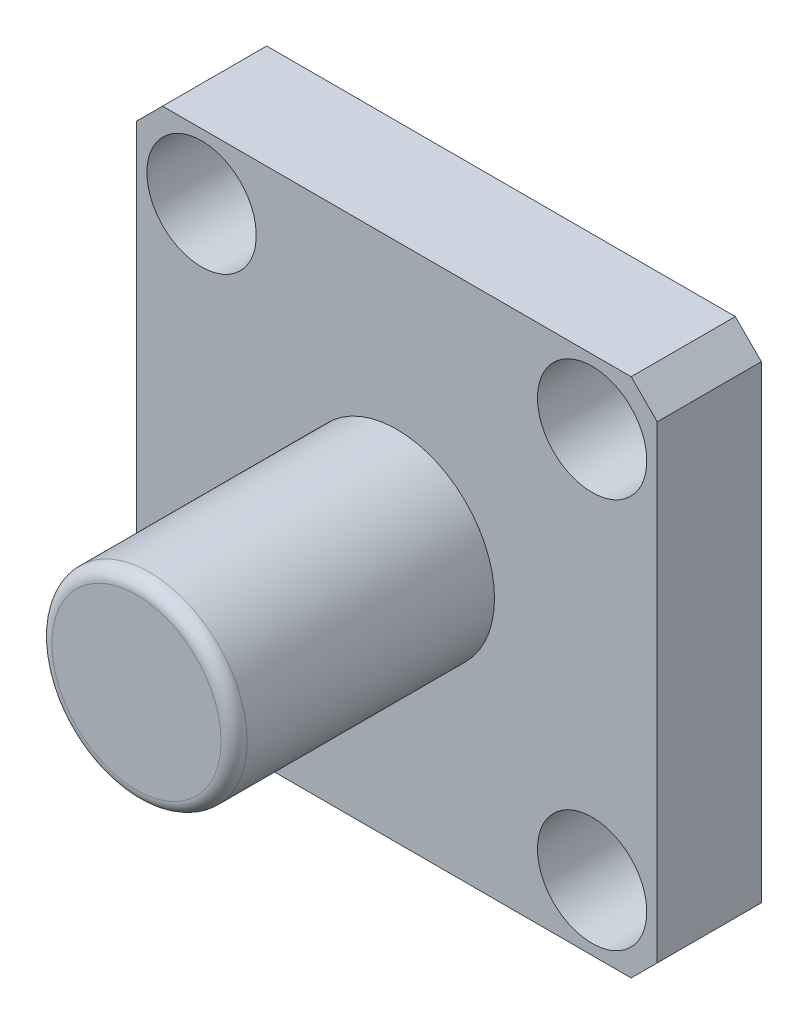
ISO-10303-21;
HEADER;
FILE_DESCRIPTION(('STEP AP214'),'2;1');
FILE_NAME('part.step','',(''),(''),'','','');
FILE_SCHEMA(('AUTOMOTIVE_DESIGN { 1 0 10303 214 1 1 1 1 }'));
ENDSEC;
DATA;
#1=APPLICATION_CONTEXT('core data for automotive mechanical design processes');
#2=APPLICATION_PROTOCOL_DEFINITION('international standard','automotive_design',2000,#1);
#3=PRODUCT_CONTEXT('',#1,'mechanical');
#4=PRODUCT('Part','Part','',(#3));
#5=PRODUCT_RELATED_PRODUCT_CATEGORY('part','',(#4));
#6=PRODUCT_DEFINITION_FORMATION('','',#4);
#7=PRODUCT_DEFINITION_CONTEXT('part definition',#1,'design');
#8=PRODUCT_DEFINITION('design','',#6,#7);
#9=PRODUCT_DEFINITION_SHAPE('','',#8);
#10=(LENGTH_UNIT() NAMED_UNIT(*) SI_UNIT(.MILLI.,.METRE.));
#11=(NAMED_UNIT(*) PLANE_ANGLE_UNIT() SI_UNIT($,.RADIAN.));
#12=(NAMED_UNIT(*) SI_UNIT($,.STERADIAN.) SOLID_ANGLE_UNIT());
#13=UNCERTAINTY_MEASURE_WITH_UNIT(LENGTH_MEASURE(1.E-05),#10,'distance_accuracy_value','');
#14=(GEOMETRIC_REPRESENTATION_CONTEXT(3) GLOBAL_UNCERTAINTY_ASSIGNED_CONTEXT((#13)) GLOBAL_UNIT_ASSIGNED_CONTEXT((#10,
#11,#12)) REPRESENTATION_CONTEXT('',''));
#15=CARTESIAN_POINT('',(0.,0.,0.));
#16=DIRECTION('',(0.,0.,1.));
#17=DIRECTION('',(1.,0.,0.));
#18=AXIS2_PLACEMENT_3D('',#15,#16,#17);
#19=CARTESIAN_POINT('',(10.,-10.,4.));
#20=DIRECTION('',(-1.,0.,0.));
#21=DIRECTION('',(0.,0.,1.));
#22=AXIS2_PLACEMENT_3D('',#19,#20,#21);
#23=PLANE('',#22);
#24=DIRECTION('',(0.,1.,0.));
#25=VECTOR('',#24,1.);
#26=CARTESIAN_POINT('',(10.,-10.,4.));
#27=LINE('',#26,#25);
#28=CARTESIAN_POINT('',(10.,-8.99999999999999,4.));
#29=VERTEX_POINT('',#28);
#30=CARTESIAN_POINT('',(10.,9.,4.));
#31=VERTEX_POINT('',#30);
#32=EDGE_CURVE('E137',#29,#31,#27,.T.);
#33=ORIENTED_EDGE('',*,*,#32,.F.);
#34=DIRECTION('',(0.,0.,-1.));
#35=VECTOR('',#34,1.);
#36=CARTESIAN_POINT('',(10.,-8.99999999999999,4.));
#37=LINE('',#36,#35);
#38=CARTESIAN_POINT('',(10.,-8.99999999999999,0.));
#39=VERTEX_POINT('',#38);
#40=EDGE_CURVE('E209',#29,#39,#37,.T.);
#41=ORIENTED_EDGE('',*,*,#40,.T.);
#42=DIRECTION('',(0.,1.,0.));
#43=VECTOR('',#42,1.);
#44=CARTESIAN_POINT('',(10.,-10.,0.));
#45=LINE('',#44,#43);
#46=CARTESIAN_POINT('',(10.,9.,0.));
#47=VERTEX_POINT('',#46);
#48=EDGE_CURVE('E152',#39,#47,#45,.T.);
#49=ORIENTED_EDGE('',*,*,#48,.T.);
#50=DIRECTION('',(0.,0.,1.));
#51=VECTOR('',#50,1.);
#52=CARTESIAN_POINT('',(10.,9.,4.));
#53=LINE('',#52,#51);
#54=EDGE_CURVE('E206',#47,#31,#53,.T.);
#55=ORIENTED_EDGE('',*,*,#54,.T.);
#56=EDGE_LOOP('',(#33,#41,#49,#55));
#57=FACE_BOUND('',#56,.T.);
#58=ADVANCED_FACE('F40',(#57),#23,.F.);
#59=CARTESIAN_POINT('',(-10.,10.,4.));
#60=DIRECTION('',(0.,-1.,0.));
#61=DIRECTION('',(0.,0.,-1.));
#62=AXIS2_PLACEMENT_3D('',#59,#60,#61);
#63=PLANE('',#62);
#64=DIRECTION('',(-1.,0.,0.));
#65=VECTOR('',#64,1.);
#66=CARTESIAN_POINT('',(-10.,10.,4.));
#67=LINE('',#66,#65);
#68=CARTESIAN_POINT('',(9.,10.,4.));
#69=VERTEX_POINT('',#68);
#70=CARTESIAN_POINT('',(-9.,10.,4.));
#71=VERTEX_POINT('',#70);
#72=EDGE_CURVE('E142',#69,#71,#67,.T.);
#73=ORIENTED_EDGE('',*,*,#72,.F.);
#74=DIRECTION('',(0.,0.,-1.));
#75=VECTOR('',#74,1.);
#76=CARTESIAN_POINT('',(9.,10.,4.));
#77=LINE('',#76,#75);
#78=CARTESIAN_POINT('',(9.,10.,0.));
#79=VERTEX_POINT('',#78);
#80=EDGE_CURVE('E11',#69,#79,#77,.T.);
#81=ORIENTED_EDGE('',*,*,#80,.T.);
#82=DIRECTION('',(-1.,0.,0.));
#83=VECTOR('',#82,1.);
#84=CARTESIAN_POINT('',(-10.,10.,0.));
#85=LINE('',#84,#83);
#86=CARTESIAN_POINT('',(-9.,10.,0.));
#87=VERTEX_POINT('',#86);
#88=EDGE_CURVE('E144',#79,#87,#85,.T.);
#89=ORIENTED_EDGE('',*,*,#88,.T.);
#90=DIRECTION('',(0.,0.,1.));
#91=VECTOR('',#90,1.);
#92=CARTESIAN_POINT('',(-9.,10.,4.));
#93=LINE('',#92,#91);
#94=EDGE_CURVE('E50',#87,#71,#93,.T.);
#95=ORIENTED_EDGE('',*,*,#94,.T.);
#96=EDGE_LOOP('',(#73,#81,#89,#95));
#97=FACE_BOUND('',#96,.T.);
#98=ADVANCED_FACE('F230',(#97),#63,.F.);
#99=CARTESIAN_POINT('',(-10.,-10.,4.));
#100=DIRECTION('',(1.,0.,0.));
#101=DIRECTION('',(0.,0.,-1.));
#102=AXIS2_PLACEMENT_3D('',#99,#100,#101);
#103=PLANE('',#102);
#104=DIRECTION('',(0.,-1.,0.));
#105=VECTOR('',#104,1.);
#106=CARTESIAN_POINT('',(-10.,-10.,0.));
#107=LINE('',#106,#105);
#108=CARTESIAN_POINT('',(-10.,9.,0.));
#109=VERTEX_POINT('',#108);
#110=CARTESIAN_POINT('',(-10.,-8.99999999999999,0.));
#111=VERTEX_POINT('',#110);
#112=EDGE_CURVE('E138',#109,#111,#107,.T.);
#113=ORIENTED_EDGE('',*,*,#112,.T.);
#114=DIRECTION('',(0.,0.,1.));
#115=VECTOR('',#114,1.);
#116=CARTESIAN_POINT('',(-10.,-8.99999999999999,4.));
#117=LINE('',#116,#115);
#118=CARTESIAN_POINT('',(-10.,-8.99999999999999,4.));
#119=VERTEX_POINT('',#118);
#120=EDGE_CURVE('E113',#111,#119,#117,.T.);
#121=ORIENTED_EDGE('',*,*,#120,.T.);
#122=DIRECTION('',(0.,-1.,0.));
#123=VECTOR('',#122,1.);
#124=CARTESIAN_POINT('',(-10.,-10.,4.));
#125=LINE('',#124,#123);
#126=CARTESIAN_POINT('',(-10.,9.,4.));
#127=VERTEX_POINT('',#126);
#128=EDGE_CURVE('E218',#127,#119,#125,.T.);
#129=ORIENTED_EDGE('',*,*,#128,.F.);
#130=DIRECTION('',(0.,0.,-1.));
#131=VECTOR('',#130,1.);
#132=CARTESIAN_POINT('',(-10.,9.,4.));
#133=LINE('',#132,#131);
#134=EDGE_CURVE('E119',#127,#109,#133,.T.);
#135=ORIENTED_EDGE('',*,*,#134,.T.);
#136=EDGE_LOOP('',(#113,#121,#129,#135));
#137=FACE_BOUND('',#136,.T.);
#138=ADVANCED_FACE('F237',(#137),#103,.F.);
#139=CARTESIAN_POINT('',(-10.,-10.,4.));
#140=DIRECTION('',(0.,1.,0.));
#141=DIRECTION('',(0.,0.,1.));
#142=AXIS2_PLACEMENT_3D('',#139,#140,#141);
#143=PLANE('',#142);
#144=DIRECTION('',(1.,0.,0.));
#145=VECTOR('',#144,1.);
#146=CARTESIAN_POINT('',(-10.,-10.,4.));
#147=LINE('',#146,#145);
#148=CARTESIAN_POINT('',(-8.99999999999999,-10.,4.));
#149=VERTEX_POINT('',#148);
#150=CARTESIAN_POINT('',(8.99999999999999,-10.,4.));
#151=VERTEX_POINT('',#150);
#152=EDGE_CURVE('E129',#149,#151,#147,.T.);
#153=ORIENTED_EDGE('',*,*,#152,.F.);
#154=DIRECTION('',(0.,0.,-1.));
#155=VECTOR('',#154,1.);
#156=CARTESIAN_POINT('',(-8.99999999999999,-10.,4.));
#157=LINE('',#156,#155);
#158=CARTESIAN_POINT('',(-8.99999999999999,-10.,0.));
#159=VERTEX_POINT('',#158);
#160=EDGE_CURVE('E112',#149,#159,#157,.T.);
#161=ORIENTED_EDGE('',*,*,#160,.T.);
#162=DIRECTION('',(1.,0.,0.));
#163=VECTOR('',#162,1.);
#164=CARTESIAN_POINT('',(-10.,-10.,0.));
#165=LINE('',#164,#163);
#166=CARTESIAN_POINT('',(8.99999999999999,-10.,0.));
#167=VERTEX_POINT('',#166);
#168=EDGE_CURVE('E126',#159,#167,#165,.T.);
#169=ORIENTED_EDGE('',*,*,#168,.T.);
#170=DIRECTION('',(0.,0.,1.));
#171=VECTOR('',#170,1.);
#172=CARTESIAN_POINT('',(8.99999999999999,-10.,4.));
#173=LINE('',#172,#171);
#174=EDGE_CURVE('E132',#167,#151,#173,.T.);
#175=ORIENTED_EDGE('',*,*,#174,.T.);
#176=EDGE_LOOP('',(#153,#161,#169,#175));
#177=FACE_BOUND('',#176,.T.);
#178=ADVANCED_FACE('F125',(#177),#143,.F.);
#179=CARTESIAN_POINT('',(0.,0.,4.));
#180=DIRECTION('',(0.,0.,-1.));
#181=DIRECTION('',(-1.,0.,0.));
#182=AXIS2_PLACEMENT_3D('',#179,#180,#181);
#183=PLANE('',#182);
#184=CARTESIAN_POINT('',(7.5,7.5,4.));
#185=DIRECTION('',(0.,0.,-1.));
#186=DIRECTION('',(-1.,0.,0.));
#187=AXIS2_PLACEMENT_3D('',#184,#185,#186);
#188=CIRCLE('',#187,2.1);
#189=CARTESIAN_POINT('',(5.4,7.5,4.));
#190=VERTEX_POINT('',#189);
#191=EDGE_CURVE('E166',#190,#190,#188,.T.);
#192=ORIENTED_EDGE('',*,*,#191,.T.);
#193=EDGE_LOOP('',(#192));
#194=FACE_BOUND('',#193,.T.);
#195=CARTESIAN_POINT('',(-7.5,7.5,4.));
#196=DIRECTION('',(0.,0.,-1.));
#197=DIRECTION('',(-1.,0.,0.));
#198=AXIS2_PLACEMENT_3D('',#195,#196,#197);
#199=CIRCLE('',#198,2.1);
#200=CARTESIAN_POINT('',(-9.6,7.5,4.));
#201=VERTEX_POINT('',#200);
#202=EDGE_CURVE('E160',#201,#201,#199,.T.);
#203=ORIENTED_EDGE('',*,*,#202,.T.);
#204=EDGE_LOOP('',(#203));
#205=FACE_BOUND('',#204,.T.);
#206=CARTESIAN_POINT('',(-7.5,-7.5,4.));
#207=DIRECTION('',(0.,0.,-1.));
#208=DIRECTION('',(-1.,0.,0.));
#209=AXIS2_PLACEMENT_3D('',#206,#207,#208);
#210=CIRCLE('',#209,2.1);
#211=CARTESIAN_POINT('',(-9.6,-7.5,4.));
#212=VERTEX_POINT('',#211);
#213=EDGE_CURVE('E154',#212,#212,#210,.T.);
#214=ORIENTED_EDGE('',*,*,#213,.T.);
#215=EDGE_LOOP('',(#214));
#216=FACE_BOUND('',#215,.T.);
#217=CARTESIAN_POINT('',(7.5,-7.5,4.));
#218=DIRECTION('',(0.,0.,-1.));
#219=DIRECTION('',(-1.,0.,0.));
#220=AXIS2_PLACEMENT_3D('',#217,#218,#219);
#221=CIRCLE('',#220,2.1);
#222=CARTESIAN_POINT('',(5.4,-7.5,4.));
#223=VERTEX_POINT('',#222);
#224=EDGE_CURVE('E148',#223,#223,#221,.T.);
#225=ORIENTED_EDGE('',*,*,#224,.T.);
#226=EDGE_LOOP('',(#225));
#227=FACE_BOUND('',#226,.T.);
#228=CARTESIAN_POINT('',(0.,0.,4.));
#229=DIRECTION('',(0.,0.,1.));
#230=DIRECTION('',(1.,0.,0.));
#231=AXIS2_PLACEMENT_3D('',#228,#229,#230);
#232=CIRCLE('',#231,3.75);
#233=CARTESIAN_POINT('',(3.75,0.,4.));
#234=VERTEX_POINT('',#233);
#235=EDGE_CURVE('E177',#234,#234,#232,.T.);
#236=ORIENTED_EDGE('',*,*,#235,.F.);
#237=EDGE_LOOP('',(#236));
#238=FACE_BOUND('',#237,.T.);
#239=ORIENTED_EDGE('',*,*,#128,.T.);
#240=DIRECTION('',(-0.707106781186546,0.707106781186549,0.));
#241=VECTOR('',#240,1.);
#242=CARTESIAN_POINT('',(-8.99999999999999,-10.,4.));
#243=LINE('',#242,#241);
#244=EDGE_CURVE('E203',#119,#149,#243,.F.);
#245=ORIENTED_EDGE('',*,*,#244,.T.);
#246=ORIENTED_EDGE('',*,*,#152,.T.);
#247=DIRECTION('',(-0.707106781186549,-0.707106781186546,0.));
#248=VECTOR('',#247,1.);
#249=CARTESIAN_POINT('',(10.,-8.99999999999999,4.));
#250=LINE('',#249,#248);
#251=EDGE_CURVE('E200',#151,#29,#250,.F.);
#252=ORIENTED_EDGE('',*,*,#251,.T.);
#253=ORIENTED_EDGE('',*,*,#32,.T.);
#254=DIRECTION('',(0.707106781186548,-0.707106781186548,0.));
#255=VECTOR('',#254,1.);
#256=CARTESIAN_POINT('',(9.,10.,4.));
#257=LINE('',#256,#255);
#258=EDGE_CURVE('E63',#31,#69,#257,.F.);
#259=ORIENTED_EDGE('',*,*,#258,.T.);
#260=ORIENTED_EDGE('',*,*,#72,.T.);
#261=DIRECTION('',(0.707106781186548,0.707106781186548,0.));
#262=VECTOR('',#261,1.);
#263=CARTESIAN_POINT('',(-10.,9.,4.));
#264=LINE('',#263,#262);
#265=EDGE_CURVE('E195',#71,#127,#264,.F.);
#266=ORIENTED_EDGE('',*,*,#265,.T.);
#267=EDGE_LOOP('',(#239,#245,#246,#252,#253,#259,#260,#266));
#268=FACE_BOUND('',#267,.T.);
#269=ADVANCED_FACE('F235',(#194,#205,#216,#227,#238,#268),#183,.F.);
#270=CARTESIAN_POINT('',(0.,0.,0.));
#271=DIRECTION('',(0.,0.,-1.));
#272=DIRECTION('',(-1.,0.,0.));
#273=AXIS2_PLACEMENT_3D('',#270,#271,#272);
#274=PLANE('',#273);
#275=CARTESIAN_POINT('',(7.5,7.5,0.));
#276=DIRECTION('',(0.,0.,-1.));
#277=DIRECTION('',(-1.,0.,0.));
#278=AXIS2_PLACEMENT_3D('',#275,#276,#277);
#279=CIRCLE('',#278,2.125);
#280=CARTESIAN_POINT('',(5.375,7.5,0.));
#281=VERTEX_POINT('',#280);
#282=EDGE_CURVE('E475',#281,#281,#279,.T.);
#283=ORIENTED_EDGE('',*,*,#282,.F.);
#284=EDGE_LOOP('',(#283));
#285=FACE_BOUND('',#284,.T.);
#286=CARTESIAN_POINT('',(-7.5,7.5,0.));
#287=DIRECTION('',(0.,0.,-1.));
#288=DIRECTION('',(-1.,0.,0.));
#289=AXIS2_PLACEMENT_3D('',#286,#287,#288);
#290=CIRCLE('',#289,2.125);
#291=CARTESIAN_POINT('',(-9.625,7.5,0.));
#292=VERTEX_POINT('',#291);
#293=EDGE_CURVE('E170',#292,#292,#290,.T.);
#294=ORIENTED_EDGE('',*,*,#293,.F.);
#295=EDGE_LOOP('',(#294));
#296=FACE_BOUND('',#295,.T.);
#297=CARTESIAN_POINT('',(-7.5,-7.5,0.));
#298=DIRECTION('',(0.,0.,-1.));
#299=DIRECTION('',(-1.,0.,0.));
#300=AXIS2_PLACEMENT_3D('',#297,#298,#299);
#301=CIRCLE('',#300,2.125);
#302=CARTESIAN_POINT('',(-9.625,-7.5,0.));
#303=VERTEX_POINT('',#302);
#304=EDGE_CURVE('E164',#303,#303,#301,.T.);
#305=ORIENTED_EDGE('',*,*,#304,.F.);
#306=EDGE_LOOP('',(#305));
#307=FACE_BOUND('',#306,.T.);
#308=CARTESIAN_POINT('',(7.5,-7.5,0.));
#309=DIRECTION('',(0.,0.,-1.));
#310=DIRECTION('',(-1.,0.,0.));
#311=AXIS2_PLACEMENT_3D('',#308,#309,#310);
#312=CIRCLE('',#311,2.125);
#313=CARTESIAN_POINT('',(5.375,-7.5,0.));
#314=VERTEX_POINT('',#313);
#315=EDGE_CURVE('E158',#314,#314,#312,.T.);
#316=ORIENTED_EDGE('',*,*,#315,.F.);
#317=EDGE_LOOP('',(#316));
#318=FACE_BOUND('',#317,.T.);
#319=ORIENTED_EDGE('',*,*,#168,.F.);
#320=DIRECTION('',(0.707106781186546,-0.707106781186549,0.));
#321=VECTOR('',#320,1.);
#322=CARTESIAN_POINT('',(-9.50000000000001,-9.49999999999998,0.));
#323=LINE('',#322,#321);
#324=EDGE_CURVE('E108',#159,#111,#323,.F.);
#325=ORIENTED_EDGE('',*,*,#324,.T.);
#326=ORIENTED_EDGE('',*,*,#112,.F.);
#327=DIRECTION('',(-0.707106781186548,-0.707106781186548,0.));
#328=VECTOR('',#327,1.);
#329=CARTESIAN_POINT('',(-9.5,9.5,0.));
#330=LINE('',#329,#328);
#331=EDGE_CURVE('E131',#109,#87,#330,.F.);
#332=ORIENTED_EDGE('',*,*,#331,.T.);
#333=ORIENTED_EDGE('',*,*,#88,.F.);
#334=DIRECTION('',(-0.707106781186548,0.707106781186548,0.));
#335=VECTOR('',#334,1.);
#336=CARTESIAN_POINT('',(9.5,9.5,0.));
#337=LINE('',#336,#335);
#338=EDGE_CURVE('E185',#79,#47,#337,.F.);
#339=ORIENTED_EDGE('',*,*,#338,.T.);
#340=ORIENTED_EDGE('',*,*,#48,.F.);
#341=DIRECTION('',(0.707106781186549,0.707106781186546,0.));
#342=VECTOR('',#341,1.);
#343=CARTESIAN_POINT('',(9.49999999999998,-9.50000000000001,0.));
#344=LINE('',#343,#342);
#345=EDGE_CURVE('E120',#39,#167,#344,.F.);
#346=ORIENTED_EDGE('',*,*,#345,.T.);
#347=EDGE_LOOP('',(#319,#325,#326,#332,#333,#339,#340,#346));
#348=FACE_BOUND('',#347,.T.);
#349=ADVANCED_FACE('F134',(#285,#296,#307,#318,#348),#274,.T.);
#350=CARTESIAN_POINT('',(0.,0.,14.));
#351=DIRECTION('',(0.,0.,-1.));
#352=DIRECTION('',(-1.,0.,0.));
#353=AXIS2_PLACEMENT_3D('',#350,#351,#352);
#354=CYLINDRICAL_SURFACE('',#353,3.75);
#355=CARTESIAN_POINT('',(0.,0.,13.5));
#356=DIRECTION('',(0.,0.,1.));
#357=DIRECTION('',(1.,0.,0.));
#358=AXIS2_PLACEMENT_3D('',#355,#356,#357);
#359=CIRCLE('',#358,3.75);
#360=CARTESIAN_POINT('',(3.75,0.,13.5));
#361=VERTEX_POINT('',#360);
#362=EDGE_CURVE('E176',#361,#361,#359,.F.);
#363=ORIENTED_EDGE('',*,*,#362,.T.);
#364=EDGE_LOOP('',(#363));
#365=FACE_BOUND('',#364,.T.);
#366=ORIENTED_EDGE('',*,*,#235,.T.);
#367=EDGE_LOOP('',(#366));
#368=FACE_BOUND('',#367,.T.);
#369=ADVANCED_FACE('F309',(#365,#368),#354,.T.);
#370=CARTESIAN_POINT('',(0.,0.,14.));
#371=DIRECTION('',(0.,0.,1.));
#372=DIRECTION('',(1.,0.,0.));
#373=AXIS2_PLACEMENT_3D('',#370,#371,#372);
#374=PLANE('',#373);
#375=CARTESIAN_POINT('',(0.,0.,14.));
#376=DIRECTION('',(0.,0.,1.));
#377=DIRECTION('',(1.,0.,0.));
#378=AXIS2_PLACEMENT_3D('',#375,#376,#377);
#379=CIRCLE('',#378,3.25);
#380=CARTESIAN_POINT('',(3.25,0.,14.));
#381=VERTEX_POINT('',#380);
#382=EDGE_CURVE('E172',#381,#381,#379,.T.);
#383=ORIENTED_EDGE('',*,*,#382,.T.);
#384=EDGE_LOOP('',(#383));
#385=FACE_BOUND('',#384,.T.);
#386=ADVANCED_FACE('F353',(#385),#374,.T.);
#387=CARTESIAN_POINT('',(7.5,-7.5,0.));
#388=DIRECTION('',(0.,0.,-1.));
#389=DIRECTION('',(-1.,0.,0.));
#390=AXIS2_PLACEMENT_3D('',#387,#388,#389);
#391=CYLINDRICAL_SURFACE('',#390,2.1);
#392=CARTESIAN_POINT('',(7.5,-7.5,0.0250000000000007));
#393=DIRECTION('',(0.,0.,-1.));
#394=DIRECTION('',(-1.,0.,0.));
#395=AXIS2_PLACEMENT_3D('',#392,#393,#394);
#396=CIRCLE('',#395,2.1);
#397=CARTESIAN_POINT('',(5.4,-7.5,0.0250000000000007));
#398=VERTEX_POINT('',#397);
#399=EDGE_CURVE('E153',#398,#398,#396,.T.);
#400=ORIENTED_EDGE('',*,*,#399,.T.);
#401=EDGE_LOOP('',(#400));
#402=FACE_BOUND('',#401,.T.);
#403=ORIENTED_EDGE('',*,*,#224,.F.);
#404=EDGE_LOOP('',(#403));
#405=FACE_BOUND('',#404,.T.);
#406=ADVANCED_FACE('F358',(#402,#405),#391,.F.);
#407=CARTESIAN_POINT('',(7.5,-7.5,0.));
#408=DIRECTION('',(0.,0.,-1.));
#409=DIRECTION('',(-1.,0.,0.));
#410=AXIS2_PLACEMENT_3D('',#407,#408,#409);
#411=CONICAL_SURFACE('',#410,2.125,0.785398163397448);
#412=ORIENTED_EDGE('',*,*,#399,.F.);
#413=EDGE_LOOP('',(#412));
#414=FACE_BOUND('',#413,.T.);
#415=ORIENTED_EDGE('',*,*,#315,.T.);
#416=EDGE_LOOP('',(#415));
#417=FACE_BOUND('',#416,.T.);
#418=ADVANCED_FACE('F425',(#414,#417),#411,.F.);
#419=CARTESIAN_POINT('',(-7.5,-7.5,0.));
#420=DIRECTION('',(0.,0.,-1.));
#421=DIRECTION('',(-1.,0.,0.));
#422=AXIS2_PLACEMENT_3D('',#419,#420,#421);
#423=CYLINDRICAL_SURFACE('',#422,2.1);
#424=CARTESIAN_POINT('',(-7.5,-7.5,0.0250000000000007));
#425=DIRECTION('',(0.,0.,-1.));
#426=DIRECTION('',(-1.,0.,0.));
#427=AXIS2_PLACEMENT_3D('',#424,#425,#426);
#428=CIRCLE('',#427,2.1);
#429=CARTESIAN_POINT('',(-9.6,-7.5,0.0250000000000007));
#430=VERTEX_POINT('',#429);
#431=EDGE_CURVE('E159',#430,#430,#428,.T.);
#432=ORIENTED_EDGE('',*,*,#431,.T.);
#433=EDGE_LOOP('',(#432));
#434=FACE_BOUND('',#433,.T.);
#435=ORIENTED_EDGE('',*,*,#213,.F.);
#436=EDGE_LOOP('',(#435));
#437=FACE_BOUND('',#436,.T.);
#438=ADVANCED_FACE('F415',(#434,#437),#423,.F.);
#439=CARTESIAN_POINT('',(-7.5,-7.5,0.));
#440=DIRECTION('',(0.,0.,-1.));
#441=DIRECTION('',(-1.,0.,0.));
#442=AXIS2_PLACEMENT_3D('',#439,#440,#441);
#443=CONICAL_SURFACE('',#442,2.125,0.785398163397466);
#444=ORIENTED_EDGE('',*,*,#431,.F.);
#445=EDGE_LOOP('',(#444));
#446=FACE_BOUND('',#445,.T.);
#447=ORIENTED_EDGE('',*,*,#304,.T.);
#448=EDGE_LOOP('',(#447));
#449=FACE_BOUND('',#448,.T.);
#450=ADVANCED_FACE('F405',(#446,#449),#443,.F.);
#451=CARTESIAN_POINT('',(-7.5,7.5,0.));
#452=DIRECTION('',(0.,0.,-1.));
#453=DIRECTION('',(-1.,0.,0.));
#454=AXIS2_PLACEMENT_3D('',#451,#452,#453);
#455=CYLINDRICAL_SURFACE('',#454,2.1);
#456=CARTESIAN_POINT('',(-7.5,7.5,0.0250000000000007));
#457=DIRECTION('',(0.,0.,-1.));
#458=DIRECTION('',(-1.,0.,0.));
#459=AXIS2_PLACEMENT_3D('',#456,#457,#458);
#460=CIRCLE('',#459,2.1);
#461=CARTESIAN_POINT('',(-9.6,7.5,0.0250000000000007));
#462=VERTEX_POINT('',#461);
#463=EDGE_CURVE('E165',#462,#462,#460,.T.);
#464=ORIENTED_EDGE('',*,*,#463,.T.);
#465=EDGE_LOOP('',(#464));
#466=FACE_BOUND('',#465,.T.);
#467=ORIENTED_EDGE('',*,*,#202,.F.);
#468=EDGE_LOOP('',(#467));
#469=FACE_BOUND('',#468,.T.);
#470=ADVANCED_FACE('F395',(#466,#469),#455,.F.);
#471=CARTESIAN_POINT('',(-7.5,7.5,0.));
#472=DIRECTION('',(0.,0.,-1.));
#473=DIRECTION('',(-1.,0.,0.));
#474=AXIS2_PLACEMENT_3D('',#471,#472,#473);
#475=CONICAL_SURFACE('',#474,2.125,0.785398163397466);
#476=ORIENTED_EDGE('',*,*,#463,.F.);
#477=EDGE_LOOP('',(#476));
#478=FACE_BOUND('',#477,.T.);
#479=ORIENTED_EDGE('',*,*,#293,.T.);
#480=EDGE_LOOP('',(#479));
#481=FACE_BOUND('',#480,.T.);
#482=ADVANCED_FACE('F385',(#478,#481),#475,.F.);
#483=CARTESIAN_POINT('',(7.5,7.5,0.));
#484=DIRECTION('',(0.,0.,-1.));
#485=DIRECTION('',(-1.,0.,0.));
#486=AXIS2_PLACEMENT_3D('',#483,#484,#485);
#487=CYLINDRICAL_SURFACE('',#486,2.1);
#488=CARTESIAN_POINT('',(7.5,7.5,0.0250000000000007));
#489=DIRECTION('',(0.,0.,-1.));
#490=DIRECTION('',(-1.,0.,0.));
#491=AXIS2_PLACEMENT_3D('',#488,#489,#490);
#492=CIRCLE('',#491,2.1);
#493=CARTESIAN_POINT('',(5.4,7.5,0.0250000000000007));
#494=VERTEX_POINT('',#493);
#495=EDGE_CURVE('E171',#494,#494,#492,.T.);
#496=ORIENTED_EDGE('',*,*,#495,.T.);
#497=EDGE_LOOP('',(#496));
#498=FACE_BOUND('',#497,.T.);
#499=ORIENTED_EDGE('',*,*,#191,.F.);
#500=EDGE_LOOP('',(#499));
#501=FACE_BOUND('',#500,.T.);
#502=ADVANCED_FACE('F375',(#498,#501),#487,.F.);
#503=CARTESIAN_POINT('',(7.5,7.5,0.));
#504=DIRECTION('',(0.,0.,-1.));
#505=DIRECTION('',(-1.,0.,0.));
#506=AXIS2_PLACEMENT_3D('',#503,#504,#505);
#507=CONICAL_SURFACE('',#506,2.125,0.785398163397448);
#508=ORIENTED_EDGE('',*,*,#495,.F.);
#509=EDGE_LOOP('',(#508));
#510=FACE_BOUND('',#509,.T.);
#511=ORIENTED_EDGE('',*,*,#282,.T.);
#512=EDGE_LOOP('',(#511));
#513=FACE_BOUND('',#512,.T.);
#514=ADVANCED_FACE('F256',(#510,#513),#507,.F.);
#515=CARTESIAN_POINT('',(0.,0.,13.5));
#516=DIRECTION('',(0.,0.,1.));
#517=DIRECTION('',(1.,0.,0.));
#518=AXIS2_PLACEMENT_3D('',#515,#516,#517);
#519=TOROIDAL_SURFACE('',#518,3.25,0.5);
#520=ORIENTED_EDGE('',*,*,#362,.F.);
#521=EDGE_LOOP('',(#520));
#522=FACE_BOUND('',#521,.T.);
#523=ORIENTED_EDGE('',*,*,#382,.F.);
#524=EDGE_LOOP('',(#523));
#525=FACE_BOUND('',#524,.T.);
#526=ADVANCED_FACE('F253',(#522,#525),#519,.T.);
#527=CARTESIAN_POINT('',(-8.99999999999999,-10.,4.));
#528=DIRECTION('',(0.707106781186549,0.707106781186546,0.));
#529=DIRECTION('',(0.,0.,-1.));
#530=AXIS2_PLACEMENT_3D('',#527,#528,#529);
#531=PLANE('',#530);
#532=ORIENTED_EDGE('',*,*,#244,.F.);
#533=ORIENTED_EDGE('',*,*,#120,.F.);
#534=ORIENTED_EDGE('',*,*,#324,.F.);
#535=ORIENTED_EDGE('',*,*,#160,.F.);
#536=EDGE_LOOP('',(#532,#533,#534,#535));
#537=FACE_BOUND('',#536,.T.);
#538=ADVANCED_FACE('F111',(#537),#531,.F.);
#539=CARTESIAN_POINT('',(10.,-8.99999999999999,4.));
#540=DIRECTION('',(-0.707106781186546,0.707106781186549,0.));
#541=DIRECTION('',(0.,0.,-1.));
#542=AXIS2_PLACEMENT_3D('',#539,#540,#541);
#543=PLANE('',#542);
#544=ORIENTED_EDGE('',*,*,#251,.F.);
#545=ORIENTED_EDGE('',*,*,#174,.F.);
#546=ORIENTED_EDGE('',*,*,#345,.F.);
#547=ORIENTED_EDGE('',*,*,#40,.F.);
#548=EDGE_LOOP('',(#544,#545,#546,#547));
#549=FACE_BOUND('',#548,.T.);
#550=ADVANCED_FACE('F264',(#549),#543,.F.);
#551=CARTESIAN_POINT('',(9.,10.,4.));
#552=DIRECTION('',(-0.707106781186547,-0.707106781186547,0.));
#553=DIRECTION('',(0.,0.,-1.));
#554=AXIS2_PLACEMENT_3D('',#551,#552,#553);
#555=PLANE('',#554);
#556=ORIENTED_EDGE('',*,*,#258,.F.);
#557=ORIENTED_EDGE('',*,*,#54,.F.);
#558=ORIENTED_EDGE('',*,*,#338,.F.);
#559=ORIENTED_EDGE('',*,*,#80,.F.);
#560=EDGE_LOOP('',(#556,#557,#558,#559));
#561=FACE_BOUND('',#560,.T.);
#562=ADVANCED_FACE('F269',(#561),#555,.F.);
#563=CARTESIAN_POINT('',(-10.,9.,4.));
#564=DIRECTION('',(0.707106781186547,-0.707106781186547,0.));
#565=DIRECTION('',(0.,0.,-1.));
#566=AXIS2_PLACEMENT_3D('',#563,#564,#565);
#567=PLANE('',#566);
#568=ORIENTED_EDGE('',*,*,#265,.F.);
#569=ORIENTED_EDGE('',*,*,#94,.F.);
#570=ORIENTED_EDGE('',*,*,#331,.F.);
#571=ORIENTED_EDGE('',*,*,#134,.F.);
#572=EDGE_LOOP('',(#568,#569,#570,#571));
#573=FACE_BOUND('',#572,.T.);
#574=ADVANCED_FACE('F43',(#573),#567,.F.);
#575=CLOSED_SHELL('',(#58,#98,#138,#178,#269,#349,#369,#386,#406,#418,#438,#450,#470,#482,#502,
#514,#526,#538,#550,#562,#574));
#576=MANIFOLD_SOLID_BREP('B2',#575);
#577=ADVANCED_BREP_SHAPE_REPRESENTATION('',(#18,#576),#14);
#578=SHAPE_DEFINITION_REPRESENTATION(#9,#577);
ENDSEC;
END-ISO-10303-21;
